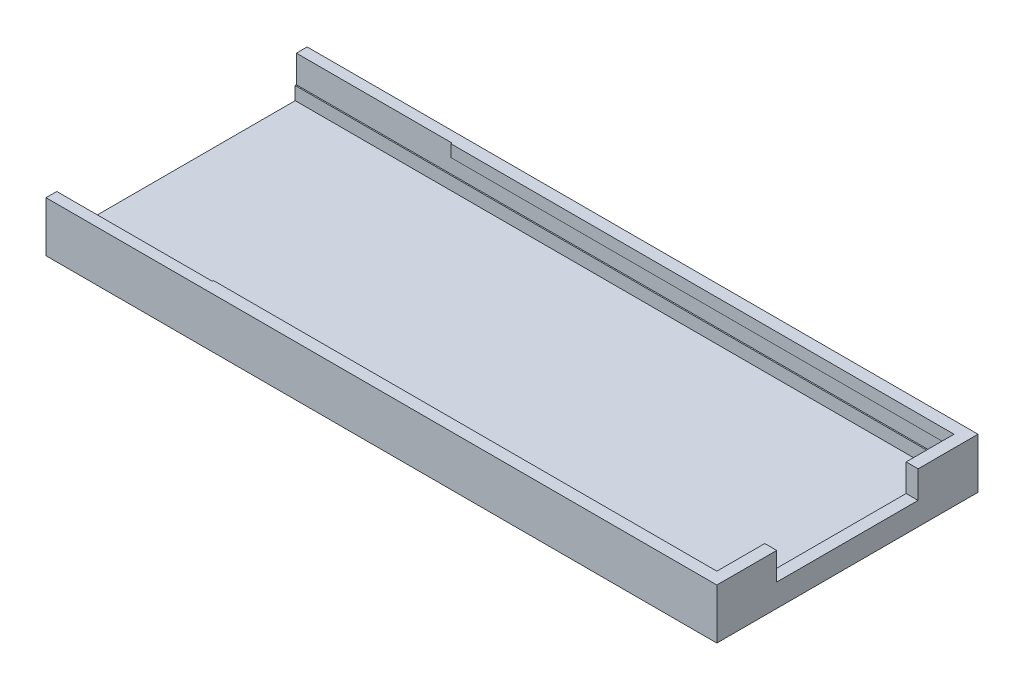
ISO-10303-21;
HEADER;
FILE_DESCRIPTION(('STEP AP214'),'2;1');
FILE_NAME('part.step','',(''),(''),'','','');
FILE_SCHEMA(('AUTOMOTIVE_DESIGN { 1 0 10303 214 1 1 1 1 }'));
ENDSEC;
DATA;
#1=APPLICATION_CONTEXT('core data for automotive mechanical design processes');
#2=APPLICATION_PROTOCOL_DEFINITION('international standard','automotive_design',2000,#1);
#3=PRODUCT_CONTEXT('',#1,'mechanical');
#4=PRODUCT('Part','Part','',(#3));
#5=PRODUCT_RELATED_PRODUCT_CATEGORY('part','',(#4));
#6=PRODUCT_DEFINITION_FORMATION('','',#4);
#7=PRODUCT_DEFINITION_CONTEXT('part definition',#1,'design');
#8=PRODUCT_DEFINITION('design','',#6,#7);
#9=PRODUCT_DEFINITION_SHAPE('','',#8);
#10=(LENGTH_UNIT() NAMED_UNIT(*) SI_UNIT(.MILLI.,.METRE.));
#11=(NAMED_UNIT(*) PLANE_ANGLE_UNIT() SI_UNIT($,.RADIAN.));
#12=(NAMED_UNIT(*) SI_UNIT($,.STERADIAN.) SOLID_ANGLE_UNIT());
#13=UNCERTAINTY_MEASURE_WITH_UNIT(LENGTH_MEASURE(1.E-05),#10,'distance_accuracy_value','');
#14=(GEOMETRIC_REPRESENTATION_CONTEXT(3) GLOBAL_UNCERTAINTY_ASSIGNED_CONTEXT((#13)) GLOBAL_UNIT_ASSIGNED_CONTEXT((#10,
#11,#12)) REPRESENTATION_CONTEXT('',''));
#15=CARTESIAN_POINT('',(0.,0.,0.));
#16=DIRECTION('',(0.,0.,1.));
#17=DIRECTION('',(1.,0.,0.));
#18=AXIS2_PLACEMENT_3D('',#15,#16,#17);
#19=CARTESIAN_POINT('',(0.,0.,0.));
#20=DIRECTION('',(1.,0.,0.));
#21=DIRECTION('',(0.,0.,-1.));
#22=AXIS2_PLACEMENT_3D('',#19,#20,#21);
#23=PLANE('',#22);
#24=DIRECTION('',(0.,1.,0.));
#25=VECTOR('',#24,1.);
#26=CARTESIAN_POINT('',(0.,1.91375000000001,-20.9));
#27=LINE('',#26,#25);
#28=CARTESIAN_POINT('',(0.,3.2,-20.9));
#29=VERTEX_POINT('',#28);
#30=CARTESIAN_POINT('',(0.,4.2,-20.9));
#31=VERTEX_POINT('',#30);
#32=EDGE_CURVE('E11',#29,#31,#27,.T.);
#33=ORIENTED_EDGE('',*,*,#32,.F.);
#34=DIRECTION('',(0.,0.,-1.));
#35=VECTOR('',#34,1.);
#36=CARTESIAN_POINT('',(0.,3.2,0.));
#37=LINE('',#36,#35);
#38=CARTESIAN_POINT('',(0.,3.2,-20.8));
#39=VERTEX_POINT('',#38);
#40=EDGE_CURVE('E317',#39,#29,#37,.T.);
#41=ORIENTED_EDGE('',*,*,#40,.F.);
#42=DIRECTION('',(0.,-1.,0.));
#43=VECTOR('',#42,1.);
#44=CARTESIAN_POINT('',(0.,0.,-20.8));
#45=LINE('',#44,#43);
#46=CARTESIAN_POINT('',(0.,4.2,-20.8));
#47=VERTEX_POINT('',#46);
#48=EDGE_CURVE('E315',#47,#39,#45,.T.);
#49=ORIENTED_EDGE('',*,*,#48,.F.);
#50=DIRECTION('',(0.,0.,1.));
#51=VECTOR('',#50,1.);
#52=CARTESIAN_POINT('',(0.,4.2,0.));
#53=LINE('',#52,#51);
#54=EDGE_CURVE('E51',#31,#47,#53,.T.);
#55=ORIENTED_EDGE('',*,*,#54,.F.);
#56=EDGE_LOOP('',(#33,#41,#49,#55));
#57=FACE_BOUND('',#56,.T.);
#58=ADVANCED_FACE('F35',(#57),#23,.F.);
#59=DIRECTION('',(0.,-1.,0.));
#60=VECTOR('',#59,1.);
#61=CARTESIAN_POINT('',(0.,4.2,-0.899999999999999));
#62=LINE('',#61,#60);
#63=CARTESIAN_POINT('',(0.,4.2,-0.9));
#64=VERTEX_POINT('',#63);
#65=CARTESIAN_POINT('',(0.,3.2,-0.899999999999999));
#66=VERTEX_POINT('',#65);
#67=EDGE_CURVE('E58',#64,#66,#62,.T.);
#68=ORIENTED_EDGE('',*,*,#67,.F.);
#69=DIRECTION('',(0.,0.,-1.));
#70=VECTOR('',#69,1.);
#71=CARTESIAN_POINT('',(0.,4.2,0.));
#72=LINE('',#71,#70);
#73=CARTESIAN_POINT('',(0.,4.2,-1.));
#74=VERTEX_POINT('',#73);
#75=EDGE_CURVE('E287',#64,#74,#72,.T.);
#76=ORIENTED_EDGE('',*,*,#75,.T.);
#77=DIRECTION('',(0.,-1.,0.));
#78=VECTOR('',#77,1.);
#79=CARTESIAN_POINT('',(0.,0.,-1.));
#80=LINE('',#79,#78);
#81=CARTESIAN_POINT('',(0.,3.2,-1.));
#82=VERTEX_POINT('',#81);
#83=EDGE_CURVE('E322',#74,#82,#80,.T.);
#84=ORIENTED_EDGE('',*,*,#83,.T.);
#85=DIRECTION('',(0.,0.,1.));
#86=VECTOR('',#85,1.);
#87=CARTESIAN_POINT('',(0.,3.2,0.));
#88=LINE('',#87,#86);
#89=EDGE_CURVE('E320',#82,#66,#88,.T.);
#90=ORIENTED_EDGE('',*,*,#89,.T.);
#91=EDGE_LOOP('',(#68,#76,#84,#90));
#92=FACE_BOUND('',#91,.T.);
#93=ADVANCED_FACE('F405',(#92),#23,.F.);
#94=CARTESIAN_POINT('',(42.,0.,0.));
#95=DIRECTION('',(0.,-1.,0.));
#96=DIRECTION('',(0.,0.,-1.));
#97=AXIS2_PLACEMENT_3D('',#94,#95,#96);
#98=PLANE('',#97);
#99=DIRECTION('',(-1.,0.,0.));
#100=VECTOR('',#99,1.);
#101=CARTESIAN_POINT('',(42.,0.,0.));
#102=LINE('',#101,#100);
#103=CARTESIAN_POINT('',(43.,0.,0.));
#104=VERTEX_POINT('',#103);
#105=CARTESIAN_POINT('',(-13.,0.,0.));
#106=VERTEX_POINT('',#105);
#107=EDGE_CURVE('E313',#104,#106,#102,.T.);
#108=ORIENTED_EDGE('',*,*,#107,.T.);
#109=DIRECTION('',(0.,0.,1.));
#110=VECTOR('',#109,1.);
#111=CARTESIAN_POINT('',(-13.,0.,-21.8));
#112=LINE('',#111,#110);
#113=CARTESIAN_POINT('',(-13.,0.,-21.8));
#114=VERTEX_POINT('',#113);
#115=EDGE_CURVE('E203',#114,#106,#112,.T.);
#116=ORIENTED_EDGE('',*,*,#115,.F.);
#117=DIRECTION('',(-1.,0.,0.));
#118=VECTOR('',#117,1.);
#119=CARTESIAN_POINT('',(42.,0.,-21.8));
#120=LINE('',#119,#118);
#121=CARTESIAN_POINT('',(43.,0.,-21.8));
#122=VERTEX_POINT('',#121);
#123=EDGE_CURVE('E39',#122,#114,#120,.T.);
#124=ORIENTED_EDGE('',*,*,#123,.F.);
#125=DIRECTION('',(0.,0.,-1.));
#126=VECTOR('',#125,1.);
#127=CARTESIAN_POINT('',(43.,0.,0.));
#128=LINE('',#127,#126);
#129=EDGE_CURVE('E261',#104,#122,#128,.T.);
#130=ORIENTED_EDGE('',*,*,#129,.F.);
#131=EDGE_LOOP('',(#108,#116,#124,#130));
#132=FACE_BOUND('',#131,.T.);
#133=ADVANCED_FACE('F37',(#132),#98,.T.);
#134=CARTESIAN_POINT('',(42.,0.,-21.8));
#135=DIRECTION('',(0.,0.,1.));
#136=DIRECTION('',(1.,0.,0.));
#137=AXIS2_PLACEMENT_3D('',#134,#135,#136);
#138=PLANE('',#137);
#139=ORIENTED_EDGE('',*,*,#123,.T.);
#140=DIRECTION('',(0.,-1.,0.));
#141=VECTOR('',#140,1.);
#142=CARTESIAN_POINT('',(-13.,4.2,-21.8));
#143=LINE('',#142,#141);
#144=CARTESIAN_POINT('',(-13.,4.2,-21.8));
#145=VERTEX_POINT('',#144);
#146=EDGE_CURVE('E198',#145,#114,#143,.T.);
#147=ORIENTED_EDGE('',*,*,#146,.F.);
#148=DIRECTION('',(-1.,0.,0.));
#149=VECTOR('',#148,1.);
#150=CARTESIAN_POINT('',(42.,4.2,-21.8));
#151=LINE('',#150,#149);
#152=CARTESIAN_POINT('',(43.,4.2,-21.8));
#153=VERTEX_POINT('',#152);
#154=EDGE_CURVE('E185',#153,#145,#151,.T.);
#155=ORIENTED_EDGE('',*,*,#154,.F.);
#156=DIRECTION('',(0.,1.,0.));
#157=VECTOR('',#156,1.);
#158=CARTESIAN_POINT('',(43.,0.,-21.8));
#159=LINE('',#158,#157);
#160=EDGE_CURVE('E259',#122,#153,#159,.T.);
#161=ORIENTED_EDGE('',*,*,#160,.F.);
#162=EDGE_LOOP('',(#139,#147,#155,#161));
#163=FACE_BOUND('',#162,.T.);
#164=ADVANCED_FACE('F199',(#163),#138,.F.);
#165=CARTESIAN_POINT('',(42.,4.2,0.));
#166=DIRECTION('',(0.,-1.,0.));
#167=DIRECTION('',(0.,0.,-1.));
#168=AXIS2_PLACEMENT_3D('',#165,#166,#167);
#169=PLANE('',#168);
#170=ORIENTED_EDGE('',*,*,#154,.T.);
#171=DIRECTION('',(0.,0.,-1.));
#172=VECTOR('',#171,1.);
#173=CARTESIAN_POINT('',(-13.,4.2,-20.9));
#174=LINE('',#173,#172);
#175=CARTESIAN_POINT('',(-13.,4.2,-20.9));
#176=VERTEX_POINT('',#175);
#177=EDGE_CURVE('E190',#176,#145,#174,.T.);
#178=ORIENTED_EDGE('',*,*,#177,.F.);
#179=DIRECTION('',(1.,0.,0.));
#180=VECTOR('',#179,1.);
#181=CARTESIAN_POINT('',(-13.,4.2,-20.9));
#182=LINE('',#181,#180);
#183=EDGE_CURVE('E236',#176,#31,#182,.T.);
#184=ORIENTED_EDGE('',*,*,#183,.T.);
#185=ORIENTED_EDGE('',*,*,#54,.T.);
#186=DIRECTION('',(-1.,0.,0.));
#187=VECTOR('',#186,1.);
#188=CARTESIAN_POINT('',(42.,4.2,-20.8));
#189=LINE('',#188,#187);
#190=CARTESIAN_POINT('',(42.,4.2,-20.8));
#191=VERTEX_POINT('',#190);
#192=EDGE_CURVE('E196',#191,#47,#189,.T.);
#193=ORIENTED_EDGE('',*,*,#192,.F.);
#194=DIRECTION('',(0.,0.,-1.));
#195=VECTOR('',#194,1.);
#196=CARTESIAN_POINT('',(42.,4.2,-16.8));
#197=LINE('',#196,#195);
#198=CARTESIAN_POINT('',(42.,4.2,-16.8));
#199=VERTEX_POINT('',#198);
#200=EDGE_CURVE('E247',#199,#191,#197,.T.);
#201=ORIENTED_EDGE('',*,*,#200,.F.);
#202=DIRECTION('',(-1.,0.,0.));
#203=VECTOR('',#202,1.);
#204=CARTESIAN_POINT('',(43.,4.2,-16.8));
#205=LINE('',#204,#203);
#206=CARTESIAN_POINT('',(43.,4.2,-16.8));
#207=VERTEX_POINT('',#206);
#208=EDGE_CURVE('E276',#207,#199,#205,.T.);
#209=ORIENTED_EDGE('',*,*,#208,.F.);
#210=DIRECTION('',(0.,0.,-1.));
#211=VECTOR('',#210,1.);
#212=CARTESIAN_POINT('',(43.,4.2,-16.8));
#213=LINE('',#212,#211);
#214=EDGE_CURVE('E192',#207,#153,#213,.T.);
#215=ORIENTED_EDGE('',*,*,#214,.T.);
#216=EDGE_LOOP('',(#170,#178,#184,#185,#193,#201,#209,#215));
#217=FACE_BOUND('',#216,.T.);
#218=ADVANCED_FACE('F187',(#217),#169,.F.);
#219=CARTESIAN_POINT('',(42.,0.,-20.8));
#220=DIRECTION('',(0.,0.,-1.));
#221=DIRECTION('',(-1.,0.,0.));
#222=AXIS2_PLACEMENT_3D('',#219,#220,#221);
#223=PLANE('',#222);
#224=ORIENTED_EDGE('',*,*,#48,.T.);
#225=DIRECTION('',(-1.,0.,0.));
#226=VECTOR('',#225,1.);
#227=CARTESIAN_POINT('',(42.,3.2,-20.8));
#228=LINE('',#227,#226);
#229=CARTESIAN_POINT('',(42.,3.2,-20.8));
#230=VERTEX_POINT('',#229);
#231=EDGE_CURVE('E351',#230,#39,#228,.T.);
#232=ORIENTED_EDGE('',*,*,#231,.F.);
#233=DIRECTION('',(0.,-1.,0.));
#234=VECTOR('',#233,1.);
#235=CARTESIAN_POINT('',(42.,0.,-20.8));
#236=LINE('',#235,#234);
#237=EDGE_CURVE('E284',#191,#230,#236,.T.);
#238=ORIENTED_EDGE('',*,*,#237,.F.);
#239=ORIENTED_EDGE('',*,*,#192,.T.);
#240=EDGE_LOOP('',(#224,#232,#238,#239));
#241=FACE_BOUND('',#240,.T.);
#242=ADVANCED_FACE('F358',(#241),#223,.F.);
#243=CARTESIAN_POINT('',(42.,3.2,0.));
#244=DIRECTION('',(0.,1.,0.));
#245=DIRECTION('',(0.,0.,1.));
#246=AXIS2_PLACEMENT_3D('',#243,#244,#245);
#247=PLANE('',#246);
#248=ORIENTED_EDGE('',*,*,#40,.T.);
#249=DIRECTION('',(-1.,0.,0.));
#250=VECTOR('',#249,1.);
#251=CARTESIAN_POINT('',(42.,3.2,-20.9));
#252=LINE('',#251,#250);
#253=CARTESIAN_POINT('',(42.,3.2,-20.9));
#254=VERTEX_POINT('',#253);
#255=EDGE_CURVE('E348',#254,#29,#252,.T.);
#256=ORIENTED_EDGE('',*,*,#255,.F.);
#257=DIRECTION('',(0.,0.,-1.));
#258=VECTOR('',#257,1.);
#259=CARTESIAN_POINT('',(42.,3.2,0.));
#260=LINE('',#259,#258);
#261=EDGE_CURVE('E286',#230,#254,#260,.T.);
#262=ORIENTED_EDGE('',*,*,#261,.F.);
#263=ORIENTED_EDGE('',*,*,#231,.T.);
#264=EDGE_LOOP('',(#248,#256,#262,#263));
#265=FACE_BOUND('',#264,.T.);
#266=ADVANCED_FACE('F364',(#265),#247,.F.);
#267=CARTESIAN_POINT('',(42.,0.,-20.9));
#268=DIRECTION('',(0.,0.,-1.));
#269=DIRECTION('',(-1.,0.,0.));
#270=AXIS2_PLACEMENT_3D('',#267,#268,#269);
#271=PLANE('',#270);
#272=ORIENTED_EDGE('',*,*,#255,.T.);
#273=ORIENTED_EDGE('',*,*,#32,.T.);
#274=ORIENTED_EDGE('',*,*,#183,.F.);
#275=DIRECTION('',(0.,1.,0.));
#276=VECTOR('',#275,1.);
#277=CARTESIAN_POINT('',(-13.,1.91375000000001,-20.9));
#278=LINE('',#277,#276);
#279=CARTESIAN_POINT('',(-13.,1.91375000000001,-20.9));
#280=VERTEX_POINT('',#279);
#281=EDGE_CURVE('E208',#280,#176,#278,.T.);
#282=ORIENTED_EDGE('',*,*,#281,.F.);
#283=DIRECTION('',(-1.,0.,0.));
#284=VECTOR('',#283,1.);
#285=CARTESIAN_POINT('',(42.,1.91375000000001,-20.9));
#286=LINE('',#285,#284);
#287=CARTESIAN_POINT('',(42.,1.91375000000001,-20.9));
#288=VERTEX_POINT('',#287);
#289=EDGE_CURVE('E346',#288,#280,#286,.T.);
#290=ORIENTED_EDGE('',*,*,#289,.F.);
#291=DIRECTION('',(0.,-1.,0.));
#292=VECTOR('',#291,1.);
#293=CARTESIAN_POINT('',(42.,0.,-20.9));
#294=LINE('',#293,#292);
#295=EDGE_CURVE('E289',#254,#288,#294,.T.);
#296=ORIENTED_EDGE('',*,*,#295,.F.);
#297=EDGE_LOOP('',(#272,#273,#274,#282,#290,#296));
#298=FACE_BOUND('',#297,.T.);
#299=ADVANCED_FACE('F368',(#298),#271,.F.);
#300=CARTESIAN_POINT('',(42.,1.91374999999851,1.36942865901107E-13));
#301=DIRECTION('',(0.,-1.,0.));
#302=DIRECTION('',(0.,0.,-1.));
#303=AXIS2_PLACEMENT_3D('',#300,#301,#302);
#304=PLANE('',#303);
#305=ORIENTED_EDGE('',*,*,#289,.T.);
#306=DIRECTION('',(0.,0.,-1.));
#307=VECTOR('',#306,1.);
#308=CARTESIAN_POINT('',(-13.,1.91375,-20.8));
#309=LINE('',#308,#307);
#310=CARTESIAN_POINT('',(-13.,1.91375,-20.8));
#311=VERTEX_POINT('',#310);
#312=EDGE_CURVE('E234',#311,#280,#309,.T.);
#313=ORIENTED_EDGE('',*,*,#312,.F.);
#314=DIRECTION('',(-1.,0.,0.));
#315=VECTOR('',#314,1.);
#316=CARTESIAN_POINT('',(42.,1.91375,-20.8));
#317=LINE('',#316,#315);
#318=CARTESIAN_POINT('',(42.,1.91375,-20.8));
#319=VERTEX_POINT('',#318);
#320=EDGE_CURVE('E344',#319,#311,#317,.T.);
#321=ORIENTED_EDGE('',*,*,#320,.F.);
#322=DIRECTION('',(0.,0.,1.));
#323=VECTOR('',#322,1.);
#324=CARTESIAN_POINT('',(42.,1.91374999999851,1.36942865901107E-13));
#325=LINE('',#324,#323);
#326=EDGE_CURVE('E291',#288,#319,#325,.T.);
#327=ORIENTED_EDGE('',*,*,#326,.F.);
#328=EDGE_LOOP('',(#305,#313,#321,#327));
#329=FACE_BOUND('',#328,.T.);
#330=ADVANCED_FACE('F429',(#329),#304,.F.);
#331=CARTESIAN_POINT('',(42.,0.,-20.8));
#332=DIRECTION('',(0.,0.,-1.));
#333=DIRECTION('',(-1.,0.,0.));
#334=AXIS2_PLACEMENT_3D('',#331,#332,#333);
#335=PLANE('',#334);
#336=ORIENTED_EDGE('',*,*,#320,.T.);
#337=DIRECTION('',(0.,1.,0.));
#338=VECTOR('',#337,1.);
#339=CARTESIAN_POINT('',(-13.,0.813750000000002,-20.8));
#340=LINE('',#339,#338);
#341=CARTESIAN_POINT('',(-13.,0.813750000000002,-20.8));
#342=VERTEX_POINT('',#341);
#343=EDGE_CURVE('E231',#342,#311,#340,.T.);
#344=ORIENTED_EDGE('',*,*,#343,.F.);
#345=DIRECTION('',(-1.,0.,0.));
#346=VECTOR('',#345,1.);
#347=CARTESIAN_POINT('',(42.,0.813750000000002,-20.8));
#348=LINE('',#347,#346);
#349=CARTESIAN_POINT('',(42.,0.813750000000002,-20.8));
#350=VERTEX_POINT('',#349);
#351=EDGE_CURVE('E342',#350,#342,#348,.T.);
#352=ORIENTED_EDGE('',*,*,#351,.F.);
#353=DIRECTION('',(0.,-1.,0.));
#354=VECTOR('',#353,1.);
#355=CARTESIAN_POINT('',(42.,0.,-20.8));
#356=LINE('',#355,#354);
#357=EDGE_CURVE('E293',#319,#350,#356,.T.);
#358=ORIENTED_EDGE('',*,*,#357,.F.);
#359=EDGE_LOOP('',(#336,#344,#352,#358));
#360=FACE_BOUND('',#359,.T.);
#361=ADVANCED_FACE('F426',(#360),#335,.F.);
#362=CARTESIAN_POINT('',(42.,0.81375,0.));
#363=DIRECTION('',(0.,1.,0.));
#364=DIRECTION('',(0.,0.,1.));
#365=AXIS2_PLACEMENT_3D('',#362,#363,#364);
#366=PLANE('',#365);
#367=ORIENTED_EDGE('',*,*,#351,.T.);
#368=DIRECTION('',(0.,0.,-1.));
#369=VECTOR('',#368,1.);
#370=CARTESIAN_POINT('',(-13.,0.81375,-1.));
#371=LINE('',#370,#369);
#372=CARTESIAN_POINT('',(-13.,0.81375,-1.));
#373=VERTEX_POINT('',#372);
#374=EDGE_CURVE('E228',#373,#342,#371,.T.);
#375=ORIENTED_EDGE('',*,*,#374,.F.);
#376=DIRECTION('',(-1.,0.,0.));
#377=VECTOR('',#376,1.);
#378=CARTESIAN_POINT('',(42.,0.81375,-1.));
#379=LINE('',#378,#377);
#380=CARTESIAN_POINT('',(42.,0.81375,-1.));
#381=VERTEX_POINT('',#380);
#382=EDGE_CURVE('E340',#381,#373,#379,.T.);
#383=ORIENTED_EDGE('',*,*,#382,.F.);
#384=DIRECTION('',(0.,0.,-1.));
#385=VECTOR('',#384,1.);
#386=CARTESIAN_POINT('',(42.,0.81375,0.));
#387=LINE('',#386,#385);
#388=EDGE_CURVE('E295',#381,#350,#387,.T.);
#389=ORIENTED_EDGE('',*,*,#388,.T.);
#390=EDGE_LOOP('',(#367,#375,#383,#389));
#391=FACE_BOUND('',#390,.T.);
#392=ADVANCED_FACE('F422',(#391),#366,.T.);
#393=CARTESIAN_POINT('',(42.,0.,-1.));
#394=DIRECTION('',(0.,0.,-1.));
#395=DIRECTION('',(-1.,0.,0.));
#396=AXIS2_PLACEMENT_3D('',#393,#394,#395);
#397=PLANE('',#396);
#398=ORIENTED_EDGE('',*,*,#382,.T.);
#399=DIRECTION('',(0.,-1.,0.));
#400=VECTOR('',#399,1.);
#401=CARTESIAN_POINT('',(-13.,0.81375,-1.));
#402=LINE('',#401,#400);
#403=CARTESIAN_POINT('',(-13.,1.91375,-1.));
#404=VERTEX_POINT('',#403);
#405=EDGE_CURVE('E225',#404,#373,#402,.T.);
#406=ORIENTED_EDGE('',*,*,#405,.F.);
#407=DIRECTION('',(-1.,0.,0.));
#408=VECTOR('',#407,1.);
#409=CARTESIAN_POINT('',(42.,1.91375,-1.));
#410=LINE('',#409,#408);
#411=CARTESIAN_POINT('',(42.,1.91375,-1.));
#412=VERTEX_POINT('',#411);
#413=EDGE_CURVE('E338',#412,#404,#410,.T.);
#414=ORIENTED_EDGE('',*,*,#413,.F.);
#415=DIRECTION('',(0.,-1.,0.));
#416=VECTOR('',#415,1.);
#417=CARTESIAN_POINT('',(42.,0.,-1.));
#418=LINE('',#417,#416);
#419=EDGE_CURVE('E298',#412,#381,#418,.T.);
#420=ORIENTED_EDGE('',*,*,#419,.T.);
#421=EDGE_LOOP('',(#398,#406,#414,#420));
#422=FACE_BOUND('',#421,.T.);
#423=ADVANCED_FACE('F417',(#422),#397,.T.);
#424=CARTESIAN_POINT('',(42.,1.91375,0.));
#425=DIRECTION('',(0.,1.,0.));
#426=DIRECTION('',(0.,0.,1.));
#427=AXIS2_PLACEMENT_3D('',#424,#425,#426);
#428=PLANE('',#427);
#429=ORIENTED_EDGE('',*,*,#413,.T.);
#430=DIRECTION('',(0.,0.,-1.));
#431=VECTOR('',#430,1.);
#432=CARTESIAN_POINT('',(-13.,1.91375,-1.));
#433=LINE('',#432,#431);
#434=CARTESIAN_POINT('',(-13.,1.91375,-0.9));
#435=VERTEX_POINT('',#434);
#436=EDGE_CURVE('E222',#435,#404,#433,.T.);
#437=ORIENTED_EDGE('',*,*,#436,.F.);
#438=DIRECTION('',(-1.,0.,0.));
#439=VECTOR('',#438,1.);
#440=CARTESIAN_POINT('',(42.,1.91375,-0.9));
#441=LINE('',#440,#439);
#442=CARTESIAN_POINT('',(42.,1.91375,-0.9));
#443=VERTEX_POINT('',#442);
#444=EDGE_CURVE('E336',#443,#435,#441,.T.);
#445=ORIENTED_EDGE('',*,*,#444,.F.);
#446=DIRECTION('',(0.,0.,-1.));
#447=VECTOR('',#446,1.);
#448=CARTESIAN_POINT('',(42.,1.91375,0.));
#449=LINE('',#448,#447);
#450=EDGE_CURVE('E301',#443,#412,#449,.T.);
#451=ORIENTED_EDGE('',*,*,#450,.T.);
#452=EDGE_LOOP('',(#429,#437,#445,#451));
#453=FACE_BOUND('',#452,.T.);
#454=ADVANCED_FACE('F414',(#453),#428,.T.);
#455=CARTESIAN_POINT('',(42.,0.,-0.9));
#456=DIRECTION('',(0.,0.,-1.));
#457=DIRECTION('',(0.,1.,0.));
#458=AXIS2_PLACEMENT_3D('',#455,#456,#457);
#459=PLANE('',#458);
#460=ORIENTED_EDGE('',*,*,#444,.T.);
#461=DIRECTION('',(0.,-1.,0.));
#462=VECTOR('',#461,1.);
#463=CARTESIAN_POINT('',(-13.,4.2,-0.899999999999999));
#464=LINE('',#463,#462);
#465=CARTESIAN_POINT('',(-13.,4.2,-0.899999999999999));
#466=VERTEX_POINT('',#465);
#467=EDGE_CURVE('E219',#466,#435,#464,.T.);
#468=ORIENTED_EDGE('',*,*,#467,.F.);
#469=DIRECTION('',(1.,0.,0.));
#470=VECTOR('',#469,1.);
#471=CARTESIAN_POINT('',(-13.,4.2,-0.899999999999999));
#472=LINE('',#471,#470);
#473=EDGE_CURVE('E239',#466,#64,#472,.T.);
#474=ORIENTED_EDGE('',*,*,#473,.T.);
#475=ORIENTED_EDGE('',*,*,#67,.T.);
#476=DIRECTION('',(-1.,0.,0.));
#477=VECTOR('',#476,1.);
#478=CARTESIAN_POINT('',(42.,3.2,-0.899999999999999));
#479=LINE('',#478,#477);
#480=CARTESIAN_POINT('',(42.,3.2,-0.899999999999999));
#481=VERTEX_POINT('',#480);
#482=EDGE_CURVE('E334',#481,#66,#479,.T.);
#483=ORIENTED_EDGE('',*,*,#482,.F.);
#484=DIRECTION('',(0.,-1.,0.));
#485=VECTOR('',#484,1.);
#486=CARTESIAN_POINT('',(42.,0.,-0.9));
#487=LINE('',#486,#485);
#488=EDGE_CURVE('E304',#481,#443,#487,.T.);
#489=ORIENTED_EDGE('',*,*,#488,.T.);
#490=EDGE_LOOP('',(#460,#468,#474,#475,#483,#489));
#491=FACE_BOUND('',#490,.T.);
#492=ADVANCED_FACE('F408',(#491),#459,.T.);
#493=CARTESIAN_POINT('',(42.,3.2,0.));
#494=DIRECTION('',(0.,-1.,0.));
#495=DIRECTION('',(0.,0.,-1.));
#496=AXIS2_PLACEMENT_3D('',#493,#494,#495);
#497=PLANE('',#496);
#498=ORIENTED_EDGE('',*,*,#89,.F.);
#499=DIRECTION('',(-1.,0.,0.));
#500=VECTOR('',#499,1.);
#501=CARTESIAN_POINT('',(42.,3.2,-1.));
#502=LINE('',#501,#500);
#503=CARTESIAN_POINT('',(42.,3.2,-1.));
#504=VERTEX_POINT('',#503);
#505=EDGE_CURVE('E332',#504,#82,#502,.T.);
#506=ORIENTED_EDGE('',*,*,#505,.F.);
#507=DIRECTION('',(0.,0.,1.));
#508=VECTOR('',#507,1.);
#509=CARTESIAN_POINT('',(42.,3.2,0.));
#510=LINE('',#509,#508);
#511=EDGE_CURVE('E307',#504,#481,#510,.T.);
#512=ORIENTED_EDGE('',*,*,#511,.T.);
#513=ORIENTED_EDGE('',*,*,#482,.T.);
#514=EDGE_LOOP('',(#498,#506,#512,#513));
#515=FACE_BOUND('',#514,.T.);
#516=ADVANCED_FACE('F452',(#515),#497,.T.);
#517=CARTESIAN_POINT('',(42.,0.,-1.));
#518=DIRECTION('',(0.,0.,-1.));
#519=DIRECTION('',(0.,1.,0.));
#520=AXIS2_PLACEMENT_3D('',#517,#518,#519);
#521=PLANE('',#520);
#522=ORIENTED_EDGE('',*,*,#83,.F.);
#523=DIRECTION('',(-1.,0.,0.));
#524=VECTOR('',#523,1.);
#525=CARTESIAN_POINT('',(42.,4.2,-1.));
#526=LINE('',#525,#524);
#527=CARTESIAN_POINT('',(42.,4.2,-1.));
#528=VERTEX_POINT('',#527);
#529=EDGE_CURVE('E329',#528,#74,#526,.T.);
#530=ORIENTED_EDGE('',*,*,#529,.F.);
#531=DIRECTION('',(0.,-1.,0.));
#532=VECTOR('',#531,1.);
#533=CARTESIAN_POINT('',(42.,0.,-1.));
#534=LINE('',#533,#532);
#535=EDGE_CURVE('E310',#528,#504,#534,.T.);
#536=ORIENTED_EDGE('',*,*,#535,.T.);
#537=ORIENTED_EDGE('',*,*,#505,.T.);
#538=EDGE_LOOP('',(#522,#530,#536,#537));
#539=FACE_BOUND('',#538,.T.);
#540=ADVANCED_FACE('F402',(#539),#521,.T.);
#541=CARTESIAN_POINT('',(42.,4.2,0.));
#542=DIRECTION('',(0.,1.,0.));
#543=DIRECTION('',(0.,0.,1.));
#544=AXIS2_PLACEMENT_3D('',#541,#542,#543);
#545=PLANE('',#544);
#546=ORIENTED_EDGE('',*,*,#75,.F.);
#547=ORIENTED_EDGE('',*,*,#473,.F.);
#548=DIRECTION('',(0.,0.,-1.));
#549=VECTOR('',#548,1.);
#550=CARTESIAN_POINT('',(-13.,4.2,0.));
#551=LINE('',#550,#549);
#552=CARTESIAN_POINT('',(-13.,4.2,0.));
#553=VERTEX_POINT('',#552);
#554=EDGE_CURVE('E217',#553,#466,#551,.T.);
#555=ORIENTED_EDGE('',*,*,#554,.F.);
#556=DIRECTION('',(-1.,0.,0.));
#557=VECTOR('',#556,1.);
#558=CARTESIAN_POINT('',(42.,4.2,0.));
#559=LINE('',#558,#557);
#560=CARTESIAN_POINT('',(43.,4.2,0.));
#561=VERTEX_POINT('',#560);
#562=EDGE_CURVE('E327',#561,#553,#559,.T.);
#563=ORIENTED_EDGE('',*,*,#562,.F.);
#564=DIRECTION('',(0.,0.,-1.));
#565=VECTOR('',#564,1.);
#566=CARTESIAN_POINT('',(43.,4.2,0.));
#567=LINE('',#566,#565);
#568=CARTESIAN_POINT('',(43.,4.2,-5.));
#569=VERTEX_POINT('',#568);
#570=EDGE_CURVE('E246',#561,#569,#567,.T.);
#571=ORIENTED_EDGE('',*,*,#570,.T.);
#572=DIRECTION('',(-1.,0.,0.));
#573=VECTOR('',#572,1.);
#574=CARTESIAN_POINT('',(43.,4.2,-5.));
#575=LINE('',#574,#573);
#576=CARTESIAN_POINT('',(42.,4.2,-5.));
#577=VERTEX_POINT('',#576);
#578=EDGE_CURVE('E264',#569,#577,#575,.T.);
#579=ORIENTED_EDGE('',*,*,#578,.T.);
#580=DIRECTION('',(0.,0.,-1.));
#581=VECTOR('',#580,1.);
#582=CARTESIAN_POINT('',(42.,4.2,0.));
#583=LINE('',#582,#581);
#584=EDGE_CURVE('E242',#528,#577,#583,.T.);
#585=ORIENTED_EDGE('',*,*,#584,.F.);
#586=ORIENTED_EDGE('',*,*,#529,.T.);
#587=EDGE_LOOP('',(#546,#547,#555,#563,#571,#579,#585,#586));
#588=FACE_BOUND('',#587,.T.);
#589=ADVANCED_FACE('F391',(#588),#545,.T.);
#590=CARTESIAN_POINT('',(42.,0.,0.));
#591=DIRECTION('',(0.,0.,1.));
#592=DIRECTION('',(1.,0.,0.));
#593=AXIS2_PLACEMENT_3D('',#590,#591,#592);
#594=PLANE('',#593);
#595=ORIENTED_EDGE('',*,*,#562,.T.);
#596=DIRECTION('',(0.,1.,0.));
#597=VECTOR('',#596,1.);
#598=CARTESIAN_POINT('',(-13.,0.,0.));
#599=LINE('',#598,#597);
#600=EDGE_CURVE('E214',#106,#553,#599,.T.);
#601=ORIENTED_EDGE('',*,*,#600,.F.);
#602=ORIENTED_EDGE('',*,*,#107,.F.);
#603=DIRECTION('',(0.,1.,0.));
#604=VECTOR('',#603,1.);
#605=CARTESIAN_POINT('',(43.,0.,0.));
#606=LINE('',#605,#604);
#607=EDGE_CURVE('E243',#104,#561,#606,.T.);
#608=ORIENTED_EDGE('',*,*,#607,.T.);
#609=EDGE_LOOP('',(#595,#601,#602,#608));
#610=FACE_BOUND('',#609,.T.);
#611=ADVANCED_FACE('F389',(#610),#594,.T.);
#612=CARTESIAN_POINT('',(43.,4.2,-16.8));
#613=DIRECTION('',(0.,0.,-1.));
#614=DIRECTION('',(-1.,0.,0.));
#615=AXIS2_PLACEMENT_3D('',#612,#613,#614);
#616=PLANE('',#615);
#617=DIRECTION('',(0.,-1.,0.));
#618=VECTOR('',#617,1.);
#619=CARTESIAN_POINT('',(42.,4.2,-16.8));
#620=LINE('',#619,#618);
#621=CARTESIAN_POINT('',(42.,1.91375000000001,-16.8));
#622=VERTEX_POINT('',#621);
#623=EDGE_CURVE('E272',#199,#622,#620,.T.);
#624=ORIENTED_EDGE('',*,*,#623,.T.);
#625=DIRECTION('',(-1.,0.,0.));
#626=VECTOR('',#625,1.);
#627=CARTESIAN_POINT('',(43.,1.91375000000001,-16.8));
#628=LINE('',#627,#626);
#629=CARTESIAN_POINT('',(43.,1.91375000000001,-16.8));
#630=VERTEX_POINT('',#629);
#631=EDGE_CURVE('E278',#630,#622,#628,.T.);
#632=ORIENTED_EDGE('',*,*,#631,.F.);
#633=DIRECTION('',(0.,-1.,0.));
#634=VECTOR('',#633,1.);
#635=CARTESIAN_POINT('',(43.,4.2,-16.8));
#636=LINE('',#635,#634);
#637=EDGE_CURVE('E256',#207,#630,#636,.T.);
#638=ORIENTED_EDGE('',*,*,#637,.F.);
#639=ORIENTED_EDGE('',*,*,#208,.T.);
#640=EDGE_LOOP('',(#624,#632,#638,#639));
#641=FACE_BOUND('',#640,.T.);
#642=ADVANCED_FACE('F378',(#641),#616,.F.);
#643=CARTESIAN_POINT('',(43.,1.91375000000001,-5.));
#644=DIRECTION('',(0.,1.,0.));
#645=DIRECTION('',(0.,0.,1.));
#646=AXIS2_PLACEMENT_3D('',#643,#644,#645);
#647=PLANE('',#646);
#648=DIRECTION('',(0.,0.,-1.));
#649=VECTOR('',#648,1.);
#650=CARTESIAN_POINT('',(42.,1.91375000000001,-5.));
#651=LINE('',#650,#649);
#652=CARTESIAN_POINT('',(42.,1.91375000000001,-5.));
#653=VERTEX_POINT('',#652);
#654=EDGE_CURVE('E269',#653,#622,#651,.T.);
#655=ORIENTED_EDGE('',*,*,#654,.F.);
#656=DIRECTION('',(-1.,0.,0.));
#657=VECTOR('',#656,1.);
#658=CARTESIAN_POINT('',(43.,1.91375000000001,-5.));
#659=LINE('',#658,#657);
#660=CARTESIAN_POINT('',(43.,1.91375000000001,-5.));
#661=VERTEX_POINT('',#660);
#662=EDGE_CURVE('E280',#661,#653,#659,.T.);
#663=ORIENTED_EDGE('',*,*,#662,.F.);
#664=DIRECTION('',(0.,0.,-1.));
#665=VECTOR('',#664,1.);
#666=CARTESIAN_POINT('',(43.,1.91375000000001,-5.));
#667=LINE('',#666,#665);
#668=EDGE_CURVE('E253',#661,#630,#667,.T.);
#669=ORIENTED_EDGE('',*,*,#668,.T.);
#670=ORIENTED_EDGE('',*,*,#631,.T.);
#671=EDGE_LOOP('',(#655,#663,#669,#670));
#672=FACE_BOUND('',#671,.T.);
#673=ADVANCED_FACE('F503',(#672),#647,.T.);
#674=CARTESIAN_POINT('',(43.,4.2,-5.));
#675=DIRECTION('',(0.,0.,-1.));
#676=DIRECTION('',(-1.,0.,0.));
#677=AXIS2_PLACEMENT_3D('',#674,#675,#676);
#678=PLANE('',#677);
#679=DIRECTION('',(0.,-1.,0.));
#680=VECTOR('',#679,1.);
#681=CARTESIAN_POINT('',(42.,4.2,-5.));
#682=LINE('',#681,#680);
#683=EDGE_CURVE('E266',#577,#653,#682,.T.);
#684=ORIENTED_EDGE('',*,*,#683,.F.);
#685=ORIENTED_EDGE('',*,*,#578,.F.);
#686=DIRECTION('',(0.,-1.,0.));
#687=VECTOR('',#686,1.);
#688=CARTESIAN_POINT('',(43.,4.2,-5.));
#689=LINE('',#688,#687);
#690=EDGE_CURVE('E250',#569,#661,#689,.T.);
#691=ORIENTED_EDGE('',*,*,#690,.T.);
#692=ORIENTED_EDGE('',*,*,#662,.T.);
#693=EDGE_LOOP('',(#684,#685,#691,#692));
#694=FACE_BOUND('',#693,.T.);
#695=ADVANCED_FACE('F396',(#694),#678,.T.);
#696=CARTESIAN_POINT('',(43.,0.,0.));
#697=DIRECTION('',(-1.,0.,0.));
#698=DIRECTION('',(0.,0.,1.));
#699=AXIS2_PLACEMENT_3D('',#696,#697,#698);
#700=PLANE('',#699);
#701=ORIENTED_EDGE('',*,*,#607,.F.);
#702=ORIENTED_EDGE('',*,*,#129,.T.);
#703=ORIENTED_EDGE('',*,*,#160,.T.);
#704=ORIENTED_EDGE('',*,*,#214,.F.);
#705=ORIENTED_EDGE('',*,*,#637,.T.);
#706=ORIENTED_EDGE('',*,*,#668,.F.);
#707=ORIENTED_EDGE('',*,*,#690,.F.);
#708=ORIENTED_EDGE('',*,*,#570,.F.);
#709=EDGE_LOOP('',(#701,#702,#703,#704,#705,#706,#707,#708));
#710=FACE_BOUND('',#709,.T.);
#711=ADVANCED_FACE('F382',(#710),#700,.F.);
#712=CARTESIAN_POINT('',(42.,0.,0.));
#713=DIRECTION('',(-1.,0.,0.));
#714=DIRECTION('',(0.,0.,1.));
#715=AXIS2_PLACEMENT_3D('',#712,#713,#714);
#716=PLANE('',#715);
#717=ORIENTED_EDGE('',*,*,#200,.T.);
#718=ORIENTED_EDGE('',*,*,#237,.T.);
#719=ORIENTED_EDGE('',*,*,#261,.T.);
#720=ORIENTED_EDGE('',*,*,#295,.T.);
#721=ORIENTED_EDGE('',*,*,#326,.T.);
#722=ORIENTED_EDGE('',*,*,#357,.T.);
#723=ORIENTED_EDGE('',*,*,#388,.F.);
#724=ORIENTED_EDGE('',*,*,#419,.F.);
#725=ORIENTED_EDGE('',*,*,#450,.F.);
#726=ORIENTED_EDGE('',*,*,#488,.F.);
#727=ORIENTED_EDGE('',*,*,#511,.F.);
#728=ORIENTED_EDGE('',*,*,#535,.F.);
#729=ORIENTED_EDGE('',*,*,#584,.T.);
#730=ORIENTED_EDGE('',*,*,#683,.T.);
#731=ORIENTED_EDGE('',*,*,#654,.T.);
#732=ORIENTED_EDGE('',*,*,#623,.F.);
#733=EDGE_LOOP('',(#717,#718,#719,#720,#721,#722,#723,#724,#725,#726,#727,#728,#729,#730,#731,#732));
#734=FACE_BOUND('',#733,.T.);
#735=ADVANCED_FACE('F372',(#734),#716,.T.);
#736=CARTESIAN_POINT('',(-13.,0.,0.));
#737=DIRECTION('',(-1.,0.,0.));
#738=DIRECTION('',(0.,0.,1.));
#739=AXIS2_PLACEMENT_3D('',#736,#737,#738);
#740=PLANE('',#739);
#741=ORIENTED_EDGE('',*,*,#177,.T.);
#742=ORIENTED_EDGE('',*,*,#146,.T.);
#743=ORIENTED_EDGE('',*,*,#115,.T.);
#744=ORIENTED_EDGE('',*,*,#600,.T.);
#745=ORIENTED_EDGE('',*,*,#554,.T.);
#746=ORIENTED_EDGE('',*,*,#467,.T.);
#747=ORIENTED_EDGE('',*,*,#436,.T.);
#748=ORIENTED_EDGE('',*,*,#405,.T.);
#749=ORIENTED_EDGE('',*,*,#374,.T.);
#750=ORIENTED_EDGE('',*,*,#343,.T.);
#751=ORIENTED_EDGE('',*,*,#312,.T.);
#752=ORIENTED_EDGE('',*,*,#281,.T.);
#753=EDGE_LOOP('',(#741,#742,#743,#744,#745,#746,#747,#748,#749,#750,#751,#752));
#754=FACE_BOUND('',#753,.T.);
#755=ADVANCED_FACE('F205',(#754),#740,.T.);
#756=CLOSED_SHELL('',(#58,#93,#133,#164,#218,#242,#266,#299,#330,#361,#392,#423,#454,#492,#516,
#540,#589,#611,#642,#673,#695,#711,#735,#755));
#757=MANIFOLD_SOLID_BREP('B2',#756);
#758=ADVANCED_BREP_SHAPE_REPRESENTATION('',(#18,#757),#14);
#759=SHAPE_DEFINITION_REPRESENTATION(#9,#758);
ENDSEC;
END-ISO-10303-21;
